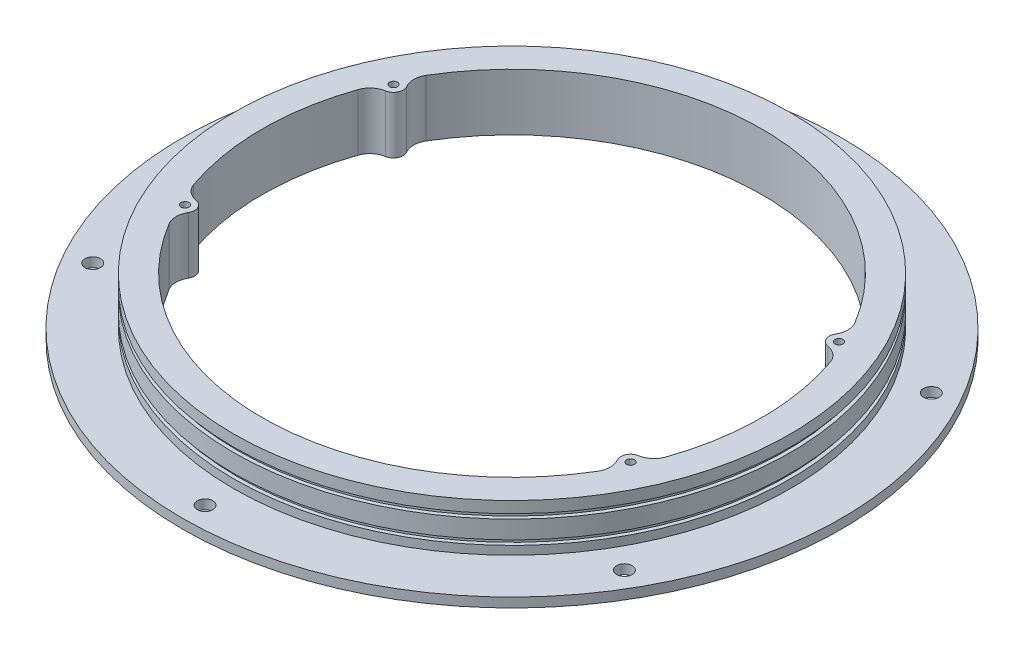
ISO-10303-21;
HEADER;
FILE_DESCRIPTION(('STEP AP214'),'2;1');
FILE_NAME('part.step','',(''),(''),'','','');
FILE_SCHEMA(('AUTOMOTIVE_DESIGN { 1 0 10303 214 1 1 1 1 }'));
ENDSEC;
DATA;
#1=APPLICATION_CONTEXT('core data for automotive mechanical design processes');
#2=APPLICATION_PROTOCOL_DEFINITION('international standard','automotive_design',2000,#1);
#3=PRODUCT_CONTEXT('',#1,'mechanical');
#4=PRODUCT('Part','Part','',(#3));
#5=PRODUCT_RELATED_PRODUCT_CATEGORY('part','',(#4));
#6=PRODUCT_DEFINITION_FORMATION('','',#4);
#7=PRODUCT_DEFINITION_CONTEXT('part definition',#1,'design');
#8=PRODUCT_DEFINITION('design','',#6,#7);
#9=PRODUCT_DEFINITION_SHAPE('','',#8);
#10=(LENGTH_UNIT() NAMED_UNIT(*) SI_UNIT(.MILLI.,.METRE.));
#11=(NAMED_UNIT(*) PLANE_ANGLE_UNIT() SI_UNIT($,.RADIAN.));
#12=(NAMED_UNIT(*) SI_UNIT($,.STERADIAN.) SOLID_ANGLE_UNIT());
#13=UNCERTAINTY_MEASURE_WITH_UNIT(LENGTH_MEASURE(1.E-05),#10,'distance_accuracy_value','');
#14=(GEOMETRIC_REPRESENTATION_CONTEXT(3) GLOBAL_UNCERTAINTY_ASSIGNED_CONTEXT((#13)) GLOBAL_UNIT_ASSIGNED_CONTEXT((#10,
#11,#12)) REPRESENTATION_CONTEXT('',''));
#15=CARTESIAN_POINT('',(0.,0.,0.));
#16=DIRECTION('',(0.,0.,1.));
#17=DIRECTION('',(1.,0.,0.));
#18=AXIS2_PLACEMENT_3D('',#15,#16,#17);
#19=CARTESIAN_POINT('',(0.,30.,0.));
#20=DIRECTION('',(0.,-1.,0.));
#21=DIRECTION('',(0.,0.,-1.));
#22=AXIS2_PLACEMENT_3D('',#19,#20,#21);
#23=CYLINDRICAL_SURFACE('',#22,146.85);
#24=CARTESIAN_POINT('',(0.,12.,0.));
#25=DIRECTION('',(0.,1.,0.));
#26=DIRECTION('',(0.,0.,1.));
#27=AXIS2_PLACEMENT_3D('',#24,#25,#26);
#28=CIRCLE('',#27,146.85);
#29=CARTESIAN_POINT('',(0.,12.,146.85));
#30=VERTEX_POINT('',#29);
#31=EDGE_CURVE('E442',#30,#30,#28,.T.);
#32=ORIENTED_EDGE('',*,*,#31,.T.);
#33=EDGE_LOOP('',(#32));
#34=FACE_BOUND('',#33,.T.);
#35=CARTESIAN_POINT('',(0.,21.5,0.));
#36=DIRECTION('',(0.,1.,0.));
#37=DIRECTION('',(0.,0.,1.));
#38=AXIS2_PLACEMENT_3D('',#35,#36,#37);
#39=CIRCLE('',#38,146.85);
#40=CARTESIAN_POINT('',(0.,21.5,146.85));
#41=VERTEX_POINT('',#40);
#42=EDGE_CURVE('E433',#41,#41,#39,.T.);
#43=ORIENTED_EDGE('',*,*,#42,.F.);
#44=EDGE_LOOP('',(#43));
#45=FACE_BOUND('',#44,.T.);
#46=ADVANCED_FACE('F43',(#34,#45),#23,.T.);
#47=CARTESIAN_POINT('',(0.,5.,0.));
#48=DIRECTION('',(0.,1.,0.));
#49=DIRECTION('',(0.,0.,1.));
#50=AXIS2_PLACEMENT_3D('',#47,#48,#49);
#51=CIRCLE('',#50,146.85);
#52=CARTESIAN_POINT('',(0.,5.,146.85));
#53=VERTEX_POINT('',#52);
#54=EDGE_CURVE('E273',#53,#53,#51,.F.);
#55=ORIENTED_EDGE('',*,*,#54,.F.);
#56=EDGE_LOOP('',(#55));
#57=FACE_BOUND('',#56,.T.);
#58=CARTESIAN_POINT('',(0.,9.5,0.));
#59=DIRECTION('',(0.,1.,0.));
#60=DIRECTION('',(0.,0.,1.));
#61=AXIS2_PLACEMENT_3D('',#58,#59,#60);
#62=CIRCLE('',#61,146.85);
#63=CARTESIAN_POINT('',(0.,9.5,146.85));
#64=VERTEX_POINT('',#63);
#65=EDGE_CURVE('E205',#64,#64,#62,.T.);
#66=ORIENTED_EDGE('',*,*,#65,.F.);
#67=EDGE_LOOP('',(#66));
#68=FACE_BOUND('',#67,.T.);
#69=ADVANCED_FACE('F399',(#57,#68),#23,.T.);
#70=CARTESIAN_POINT('',(0.,5.,0.));
#71=DIRECTION('',(0.,-1.,0.));
#72=DIRECTION('',(0.,0.,-1.));
#73=AXIS2_PLACEMENT_3D('',#70,#71,#72);
#74=CYLINDRICAL_SURFACE('',#73,131.85);
#75=CARTESIAN_POINT('',(0.,0.,0.));
#76=DIRECTION('',(0.,1.,0.));
#77=DIRECTION('',(0.,0.,1.));
#78=AXIS2_PLACEMENT_3D('',#75,#76,#77);
#79=CIRCLE('',#78,131.85);
#80=CARTESIAN_POINT('',(-124.505351615997,0.,-43.3917033426559));
#81=VERTEX_POINT('',#80);
#82=CARTESIAN_POINT('',(-124.505351615997,0.,43.3917033426559));
#83=VERTEX_POINT('',#82);
#84=EDGE_CURVE('E295',#81,#83,#79,.T.);
#85=ORIENTED_EDGE('',*,*,#84,.F.);
#86=DIRECTION('',(0.,-1.,0.));
#87=VECTOR('',#86,1.);
#88=CARTESIAN_POINT('',(-124.505351615997,30.,-43.3917033426559));
#89=LINE('',#88,#87);
#90=CARTESIAN_POINT('',(-124.505351615997,30.,-43.3917033426559));
#91=VERTEX_POINT('',#90);
#92=EDGE_CURVE('E263',#91,#81,#89,.T.);
#93=ORIENTED_EDGE('',*,*,#92,.F.);
#94=CARTESIAN_POINT('',(0.,30.,0.));
#95=DIRECTION('',(0.,1.,0.));
#96=DIRECTION('',(0.,0.,1.));
#97=AXIS2_PLACEMENT_3D('',#94,#95,#96);
#98=CIRCLE('',#97,131.85);
#99=CARTESIAN_POINT('',(-124.505351615997,30.,43.3917033426559));
#100=VERTEX_POINT('',#99);
#101=EDGE_CURVE('E332',#91,#100,#98,.T.);
#102=ORIENTED_EDGE('',*,*,#101,.T.);
#103=DIRECTION('',(0.,-1.,0.));
#104=VECTOR('',#103,1.);
#105=CARTESIAN_POINT('',(-124.505351615997,30.,43.3917033426559));
#106=LINE('',#105,#104);
#107=EDGE_CURVE('E265',#100,#83,#106,.T.);
#108=ORIENTED_EDGE('',*,*,#107,.T.);
#109=EDGE_LOOP('',(#85,#93,#102,#108));
#110=FACE_BOUND('',#109,.T.);
#111=ADVANCED_FACE('F45',(#110),#74,.F.);
#112=CARTESIAN_POINT('',(113.080257043753,0.,-67.8032297676063));
#113=VERTEX_POINT('',#112);
#114=CARTESIAN_POINT('',(-113.080257043753,0.,-67.8032297676063));
#115=VERTEX_POINT('',#114);
#116=EDGE_CURVE('E372',#113,#115,#79,.T.);
#117=ORIENTED_EDGE('',*,*,#116,.F.);
#118=DIRECTION('',(0.,-1.,0.));
#119=VECTOR('',#118,1.);
#120=CARTESIAN_POINT('',(113.080257043753,30.,-67.8032297676063));
#121=LINE('',#120,#119);
#122=CARTESIAN_POINT('',(113.080257043753,30.,-67.8032297676063));
#123=VERTEX_POINT('',#122);
#124=EDGE_CURVE('E254',#123,#113,#121,.T.);
#125=ORIENTED_EDGE('',*,*,#124,.F.);
#126=CARTESIAN_POINT('',(-113.080257043753,30.,-67.8032297676063));
#127=VERTEX_POINT('',#126);
#128=EDGE_CURVE('E192',#123,#127,#98,.T.);
#129=ORIENTED_EDGE('',*,*,#128,.T.);
#130=DIRECTION('',(0.,-1.,0.));
#131=VECTOR('',#130,1.);
#132=CARTESIAN_POINT('',(-113.080257043753,30.,-67.8032297676063));
#133=LINE('',#132,#131);
#134=EDGE_CURVE('E256',#127,#115,#133,.T.);
#135=ORIENTED_EDGE('',*,*,#134,.T.);
#136=EDGE_LOOP('',(#117,#125,#129,#135));
#137=FACE_BOUND('',#136,.T.);
#138=ADVANCED_FACE('F834',(#137),#74,.F.);
#139=CARTESIAN_POINT('',(124.505351615997,0.,43.3917033426559));
#140=VERTEX_POINT('',#139);
#141=CARTESIAN_POINT('',(124.505351615997,0.,-43.3917033426559));
#142=VERTEX_POINT('',#141);
#143=EDGE_CURVE('E296',#140,#142,#79,.T.);
#144=ORIENTED_EDGE('',*,*,#143,.F.);
#145=DIRECTION('',(0.,-1.,0.));
#146=VECTOR('',#145,1.);
#147=CARTESIAN_POINT('',(124.505351615997,30.,43.3917033426559));
#148=LINE('',#147,#146);
#149=CARTESIAN_POINT('',(124.505351615997,30.,43.3917033426559));
#150=VERTEX_POINT('',#149);
#151=EDGE_CURVE('E173',#150,#140,#148,.T.);
#152=ORIENTED_EDGE('',*,*,#151,.F.);
#153=CARTESIAN_POINT('',(124.505351615997,30.,-43.3917033426559));
#154=VERTEX_POINT('',#153);
#155=EDGE_CURVE('E188',#150,#154,#98,.T.);
#156=ORIENTED_EDGE('',*,*,#155,.T.);
#157=DIRECTION('',(0.,-1.,0.));
#158=VECTOR('',#157,1.);
#159=CARTESIAN_POINT('',(124.505351615997,30.,-43.3917033426559));
#160=LINE('',#159,#158);
#161=EDGE_CURVE('E246',#154,#142,#160,.T.);
#162=ORIENTED_EDGE('',*,*,#161,.T.);
#163=EDGE_LOOP('',(#144,#152,#156,#162));
#164=FACE_BOUND('',#163,.T.);
#165=ADVANCED_FACE('F369',(#164),#74,.F.);
#166=CARTESIAN_POINT('',(-113.080257043753,0.,67.8032297676062));
#167=VERTEX_POINT('',#166);
#168=CARTESIAN_POINT('',(113.080257043753,0.,67.8032297676062));
#169=VERTEX_POINT('',#168);
#170=EDGE_CURVE('E276',#167,#169,#79,.T.);
#171=ORIENTED_EDGE('',*,*,#170,.F.);
#172=DIRECTION('',(0.,-1.,0.));
#173=VECTOR('',#172,1.);
#174=CARTESIAN_POINT('',(-113.080257043753,30.,67.8032297676062));
#175=LINE('',#174,#173);
#176=CARTESIAN_POINT('',(-113.080257043753,30.,67.8032297676062));
#177=VERTEX_POINT('',#176);
#178=EDGE_CURVE('E123',#177,#167,#175,.T.);
#179=ORIENTED_EDGE('',*,*,#178,.F.);
#180=CARTESIAN_POINT('',(113.080257043753,30.,67.8032297676062));
#181=VERTEX_POINT('',#180);
#182=EDGE_CURVE('E193',#177,#181,#98,.T.);
#183=ORIENTED_EDGE('',*,*,#182,.T.);
#184=DIRECTION('',(0.,-1.,0.));
#185=VECTOR('',#184,1.);
#186=CARTESIAN_POINT('',(113.080257043753,30.,67.8032297676062));
#187=LINE('',#186,#185);
#188=EDGE_CURVE('E62',#181,#169,#187,.T.);
#189=ORIENTED_EDGE('',*,*,#188,.T.);
#190=EDGE_LOOP('',(#171,#179,#183,#189));
#191=FACE_BOUND('',#190,.T.);
#192=ADVANCED_FACE('F327',(#191),#74,.F.);
#193=CARTESIAN_POINT('',(0.,5.,-161.925));
#194=DIRECTION('',(0.,-1.,0.));
#195=DIRECTION('',(0.,0.,-1.));
#196=AXIS2_PLACEMENT_3D('',#193,#194,#195);
#197=CYLINDRICAL_SURFACE('',#196,4.09999999999999);
#198=CARTESIAN_POINT('',(0.,5.,-161.925));
#199=DIRECTION('',(0.,1.,0.));
#200=DIRECTION('',(0.,0.,1.));
#201=AXIS2_PLACEMENT_3D('',#198,#199,#200);
#202=CIRCLE('',#201,4.09999999999999);
#203=CARTESIAN_POINT('',(0.,5.,-157.825));
#204=VERTEX_POINT('',#203);
#205=EDGE_CURVE('E53',#204,#204,#202,.T.);
#206=ORIENTED_EDGE('',*,*,#205,.T.);
#207=EDGE_LOOP('',(#206));
#208=FACE_BOUND('',#207,.T.);
#209=CARTESIAN_POINT('',(0.,0.,-161.925));
#210=DIRECTION('',(0.,1.,0.));
#211=DIRECTION('',(0.,0.,1.));
#212=AXIS2_PLACEMENT_3D('',#209,#210,#211);
#213=CIRCLE('',#212,4.09999999999999);
#214=CARTESIAN_POINT('',(0.,0.,-157.825));
#215=VERTEX_POINT('',#214);
#216=EDGE_CURVE('E311',#215,#215,#213,.T.);
#217=ORIENTED_EDGE('',*,*,#216,.F.);
#218=EDGE_LOOP('',(#217));
#219=FACE_BOUND('',#218,.T.);
#220=ADVANCED_FACE('F484',(#208,#219),#197,.F.);
#221=CARTESIAN_POINT('',(140.231163507799,5.,-80.9625000000059));
#222=DIRECTION('',(0.,-1.,0.));
#223=DIRECTION('',(0.,0.,-1.));
#224=AXIS2_PLACEMENT_3D('',#221,#222,#223);
#225=CYLINDRICAL_SURFACE('',#224,4.09999999999998);
#226=CARTESIAN_POINT('',(140.231163507799,5.,-80.9625000000059));
#227=DIRECTION('',(0.,1.,0.));
#228=DIRECTION('',(0.,0.,1.));
#229=AXIS2_PLACEMENT_3D('',#226,#227,#228);
#230=CIRCLE('',#229,4.09999999999998);
#231=CARTESIAN_POINT('',(140.231163507799,5.,-76.862500000006));
#232=VERTEX_POINT('',#231);
#233=EDGE_CURVE('E289',#232,#232,#230,.T.);
#234=ORIENTED_EDGE('',*,*,#233,.T.);
#235=EDGE_LOOP('',(#234));
#236=FACE_BOUND('',#235,.T.);
#237=CARTESIAN_POINT('',(140.231163507799,0.,-80.9625000000059));
#238=DIRECTION('',(0.,1.,0.));
#239=DIRECTION('',(0.,0.,1.));
#240=AXIS2_PLACEMENT_3D('',#237,#238,#239);
#241=CIRCLE('',#240,4.09999999999998);
#242=CARTESIAN_POINT('',(140.231163507799,0.,-76.862500000006));
#243=VERTEX_POINT('',#242);
#244=EDGE_CURVE('E309',#243,#243,#241,.T.);
#245=ORIENTED_EDGE('',*,*,#244,.F.);
#246=EDGE_LOOP('',(#245));
#247=FACE_BOUND('',#246,.T.);
#248=ADVANCED_FACE('F487',(#236,#247),#225,.F.);
#249=CARTESIAN_POINT('',(140.231163507805,5.,80.9624999999941));
#250=DIRECTION('',(0.,-1.,0.));
#251=DIRECTION('',(0.,0.,-1.));
#252=AXIS2_PLACEMENT_3D('',#249,#250,#251);
#253=CYLINDRICAL_SURFACE('',#252,4.09999999999998);
#254=CARTESIAN_POINT('',(140.231163507805,5.,80.9624999999941));
#255=DIRECTION('',(0.,1.,0.));
#256=DIRECTION('',(0.,0.,1.));
#257=AXIS2_PLACEMENT_3D('',#254,#255,#256);
#258=CIRCLE('',#257,4.09999999999998);
#259=CARTESIAN_POINT('',(140.231163507805,5.,85.0624999999941));
#260=VERTEX_POINT('',#259);
#261=EDGE_CURVE('E286',#260,#260,#258,.T.);
#262=ORIENTED_EDGE('',*,*,#261,.T.);
#263=EDGE_LOOP('',(#262));
#264=FACE_BOUND('',#263,.T.);
#265=CARTESIAN_POINT('',(140.231163507805,0.,80.9624999999941));
#266=DIRECTION('',(0.,1.,0.));
#267=DIRECTION('',(0.,0.,1.));
#268=AXIS2_PLACEMENT_3D('',#265,#266,#267);
#269=CIRCLE('',#268,4.09999999999998);
#270=CARTESIAN_POINT('',(140.231163507805,0.,85.0624999999941));
#271=VERTEX_POINT('',#270);
#272=EDGE_CURVE('E306',#271,#271,#269,.T.);
#273=ORIENTED_EDGE('',*,*,#272,.F.);
#274=EDGE_LOOP('',(#273));
#275=FACE_BOUND('',#274,.T.);
#276=ADVANCED_FACE('F491',(#264,#275),#253,.F.);
#277=CARTESIAN_POINT('',(1.36158713980121E-11,5.,161.925));
#278=DIRECTION('',(0.,-1.,0.));
#279=DIRECTION('',(0.,0.,-1.));
#280=AXIS2_PLACEMENT_3D('',#277,#278,#279);
#281=CYLINDRICAL_SURFACE('',#280,4.09999999999999);
#282=CARTESIAN_POINT('',(1.36158713980121E-11,5.,161.925));
#283=DIRECTION('',(0.,1.,0.));
#284=DIRECTION('',(0.,0.,1.));
#285=AXIS2_PLACEMENT_3D('',#282,#283,#284);
#286=CIRCLE('',#285,4.09999999999999);
#287=CARTESIAN_POINT('',(1.36158713980121E-11,5.,166.025));
#288=VERTEX_POINT('',#287);
#289=EDGE_CURVE('E283',#288,#288,#286,.T.);
#290=ORIENTED_EDGE('',*,*,#289,.T.);
#291=EDGE_LOOP('',(#290));
#292=FACE_BOUND('',#291,.T.);
#293=CARTESIAN_POINT('',(1.36158713980121E-11,0.,161.925));
#294=DIRECTION('',(0.,1.,0.));
#295=DIRECTION('',(0.,0.,1.));
#296=AXIS2_PLACEMENT_3D('',#293,#294,#295);
#297=CIRCLE('',#296,4.09999999999999);
#298=CARTESIAN_POINT('',(1.36158713980121E-11,0.,166.025));
#299=VERTEX_POINT('',#298);
#300=EDGE_CURVE('E303',#299,#299,#297,.T.);
#301=ORIENTED_EDGE('',*,*,#300,.F.);
#302=EDGE_LOOP('',(#301));
#303=FACE_BOUND('',#302,.T.);
#304=ADVANCED_FACE('F495',(#292,#303),#281,.F.);
#305=CARTESIAN_POINT('',(-140.231163507785,5.,80.9625000000059));
#306=DIRECTION('',(0.,-1.,0.));
#307=DIRECTION('',(0.,0.,-1.));
#308=AXIS2_PLACEMENT_3D('',#305,#306,#307);
#309=CYLINDRICAL_SURFACE('',#308,4.09999999999998);
#310=CARTESIAN_POINT('',(-140.231163507785,5.,80.9625000000059));
#311=DIRECTION('',(0.,1.,0.));
#312=DIRECTION('',(0.,0.,1.));
#313=AXIS2_PLACEMENT_3D('',#310,#311,#312);
#314=CIRCLE('',#313,4.09999999999998);
#315=CARTESIAN_POINT('',(-140.231163507785,5.,85.0625000000059));
#316=VERTEX_POINT('',#315);
#317=EDGE_CURVE('E280',#316,#316,#314,.T.);
#318=ORIENTED_EDGE('',*,*,#317,.T.);
#319=EDGE_LOOP('',(#318));
#320=FACE_BOUND('',#319,.T.);
#321=CARTESIAN_POINT('',(-140.231163507785,0.,80.9625000000059));
#322=DIRECTION('',(0.,1.,0.));
#323=DIRECTION('',(0.,0.,1.));
#324=AXIS2_PLACEMENT_3D('',#321,#322,#323);
#325=CIRCLE('',#324,4.09999999999998);
#326=CARTESIAN_POINT('',(-140.231163507785,0.,85.0625000000059));
#327=VERTEX_POINT('',#326);
#328=EDGE_CURVE('E300',#327,#327,#325,.T.);
#329=ORIENTED_EDGE('',*,*,#328,.F.);
#330=EDGE_LOOP('',(#329));
#331=FACE_BOUND('',#330,.T.);
#332=ADVANCED_FACE('F499',(#320,#331),#309,.F.);
#333=CARTESIAN_POINT('',(-140.231163507792,5.,-80.962499999994));
#334=DIRECTION('',(0.,-1.,0.));
#335=DIRECTION('',(0.,0.,-1.));
#336=AXIS2_PLACEMENT_3D('',#333,#334,#335);
#337=CYLINDRICAL_SURFACE('',#336,4.09999999999998);
#338=CARTESIAN_POINT('',(-140.231163507792,5.,-80.962499999994));
#339=DIRECTION('',(0.,1.,0.));
#340=DIRECTION('',(0.,0.,1.));
#341=AXIS2_PLACEMENT_3D('',#338,#339,#340);
#342=CIRCLE('',#341,4.09999999999998);
#343=CARTESIAN_POINT('',(-140.231163507792,5.,-76.862499999994));
#344=VERTEX_POINT('',#343);
#345=EDGE_CURVE('E277',#344,#344,#342,.T.);
#346=ORIENTED_EDGE('',*,*,#345,.T.);
#347=EDGE_LOOP('',(#346));
#348=FACE_BOUND('',#347,.T.);
#349=CARTESIAN_POINT('',(-140.231163507792,0.,-80.962499999994));
#350=DIRECTION('',(0.,1.,0.));
#351=DIRECTION('',(0.,0.,1.));
#352=AXIS2_PLACEMENT_3D('',#349,#350,#351);
#353=CIRCLE('',#352,4.09999999999998);
#354=CARTESIAN_POINT('',(-140.231163507792,0.,-76.862499999994));
#355=VERTEX_POINT('',#354);
#356=EDGE_CURVE('E297',#355,#355,#353,.T.);
#357=ORIENTED_EDGE('',*,*,#356,.F.);
#358=EDGE_LOOP('',(#357));
#359=FACE_BOUND('',#358,.T.);
#360=ADVANCED_FACE('F482',(#348,#359),#337,.F.);
#361=CARTESIAN_POINT('',(0.,5.,0.));
#362=DIRECTION('',(0.,-1.,0.));
#363=DIRECTION('',(0.,0.,-1.));
#364=AXIS2_PLACEMENT_3D('',#361,#362,#363);
#365=CYLINDRICAL_SURFACE('',#364,173.85);
#366=CARTESIAN_POINT('',(0.,5.,0.));
#367=DIRECTION('',(0.,1.,0.));
#368=DIRECTION('',(0.,0.,1.));
#369=AXIS2_PLACEMENT_3D('',#366,#367,#368);
#370=CIRCLE('',#369,173.85);
#371=CARTESIAN_POINT('',(0.,5.,173.85));
#372=VERTEX_POINT('',#371);
#373=EDGE_CURVE('E11',#372,#372,#370,.T.);
#374=ORIENTED_EDGE('',*,*,#373,.F.);
#375=EDGE_LOOP('',(#374));
#376=FACE_BOUND('',#375,.T.);
#377=CARTESIAN_POINT('',(0.,0.,0.));
#378=DIRECTION('',(0.,1.,0.));
#379=DIRECTION('',(0.,0.,1.));
#380=AXIS2_PLACEMENT_3D('',#377,#378,#379);
#381=CIRCLE('',#380,173.85);
#382=CARTESIAN_POINT('',(0.,0.,173.85));
#383=VERTEX_POINT('',#382);
#384=EDGE_CURVE('E47',#383,#383,#381,.T.);
#385=ORIENTED_EDGE('',*,*,#384,.T.);
#386=EDGE_LOOP('',(#385));
#387=FACE_BOUND('',#386,.T.);
#388=ADVANCED_FACE('F318',(#376,#387),#365,.T.);
#389=CARTESIAN_POINT('',(0.,5.,0.));
#390=DIRECTION('',(0.,1.,0.));
#391=DIRECTION('',(0.,0.,1.));
#392=AXIS2_PLACEMENT_3D('',#389,#390,#391);
#393=PLANE('',#392);
#394=ORIENTED_EDGE('',*,*,#54,.T.);
#395=EDGE_LOOP('',(#394));
#396=FACE_BOUND('',#395,.T.);
#397=ORIENTED_EDGE('',*,*,#345,.F.);
#398=EDGE_LOOP('',(#397));
#399=FACE_BOUND('',#398,.T.);
#400=ORIENTED_EDGE('',*,*,#317,.F.);
#401=EDGE_LOOP('',(#400));
#402=FACE_BOUND('',#401,.T.);
#403=ORIENTED_EDGE('',*,*,#289,.F.);
#404=EDGE_LOOP('',(#403));
#405=FACE_BOUND('',#404,.T.);
#406=ORIENTED_EDGE('',*,*,#261,.F.);
#407=EDGE_LOOP('',(#406));
#408=FACE_BOUND('',#407,.T.);
#409=ORIENTED_EDGE('',*,*,#233,.F.);
#410=EDGE_LOOP('',(#409));
#411=FACE_BOUND('',#410,.T.);
#412=ORIENTED_EDGE('',*,*,#205,.F.);
#413=EDGE_LOOP('',(#412));
#414=FACE_BOUND('',#413,.T.);
#415=ORIENTED_EDGE('',*,*,#373,.T.);
#416=EDGE_LOOP('',(#415));
#417=FACE_BOUND('',#416,.T.);
#418=ADVANCED_FACE('F323',(#396,#399,#402,#405,#408,#411,#414,#417),#393,.T.);
#419=CARTESIAN_POINT('',(0.,0.,0.));
#420=DIRECTION('',(0.,1.,0.));
#421=DIRECTION('',(0.,0.,1.));
#422=AXIS2_PLACEMENT_3D('',#419,#420,#421);
#423=PLANE('',#422);
#424=CARTESIAN_POINT('',(117.516222284415,0.,55.));
#425=DIRECTION('',(0.,1.,0.));
#426=DIRECTION('',(0.,0.,1.));
#427=AXIS2_PLACEMENT_3D('',#424,#425,#426);
#428=CIRCLE('',#427,2.1);
#429=CARTESIAN_POINT('',(117.516222284415,0.,57.1));
#430=VERTEX_POINT('',#429);
#431=EDGE_CURVE('E201',#430,#430,#428,.T.);
#432=ORIENTED_EDGE('',*,*,#431,.T.);
#433=EDGE_LOOP('',(#432));
#434=FACE_BOUND('',#433,.T.);
#435=CARTESIAN_POINT('',(117.516222284415,0.,-55.));
#436=DIRECTION('',(0.,1.,0.));
#437=DIRECTION('',(0.,0.,1.));
#438=AXIS2_PLACEMENT_3D('',#435,#436,#437);
#439=CIRCLE('',#438,2.1);
#440=CARTESIAN_POINT('',(117.516222284415,0.,-52.9));
#441=VERTEX_POINT('',#440);
#442=EDGE_CURVE('E204',#441,#441,#439,.T.);
#443=ORIENTED_EDGE('',*,*,#442,.T.);
#444=EDGE_LOOP('',(#443));
#445=FACE_BOUND('',#444,.T.);
#446=CARTESIAN_POINT('',(-117.516222284415,0.,-55.));
#447=DIRECTION('',(0.,1.,0.));
#448=DIRECTION('',(0.,0.,1.));
#449=AXIS2_PLACEMENT_3D('',#446,#447,#448);
#450=CIRCLE('',#449,2.1);
#451=CARTESIAN_POINT('',(-117.516222284415,0.,-52.9));
#452=VERTEX_POINT('',#451);
#453=EDGE_CURVE('E208',#452,#452,#450,.T.);
#454=ORIENTED_EDGE('',*,*,#453,.T.);
#455=EDGE_LOOP('',(#454));
#456=FACE_BOUND('',#455,.T.);
#457=CARTESIAN_POINT('',(-117.516222284415,0.,55.));
#458=DIRECTION('',(0.,1.,0.));
#459=DIRECTION('',(0.,0.,1.));
#460=AXIS2_PLACEMENT_3D('',#457,#458,#459);
#461=CIRCLE('',#460,2.1);
#462=CARTESIAN_POINT('',(-117.516222284415,0.,57.1));
#463=VERTEX_POINT('',#462);
#464=EDGE_CURVE('E211',#463,#463,#461,.T.);
#465=ORIENTED_EDGE('',*,*,#464,.T.);
#466=EDGE_LOOP('',(#465));
#467=FACE_BOUND('',#466,.T.);
#468=ORIENTED_EDGE('',*,*,#356,.T.);
#469=EDGE_LOOP('',(#468));
#470=FACE_BOUND('',#469,.T.);
#471=ORIENTED_EDGE('',*,*,#328,.T.);
#472=EDGE_LOOP('',(#471));
#473=FACE_BOUND('',#472,.T.);
#474=ORIENTED_EDGE('',*,*,#300,.T.);
#475=EDGE_LOOP('',(#474));
#476=FACE_BOUND('',#475,.T.);
#477=ORIENTED_EDGE('',*,*,#272,.T.);
#478=EDGE_LOOP('',(#477));
#479=FACE_BOUND('',#478,.T.);
#480=ORIENTED_EDGE('',*,*,#244,.T.);
#481=EDGE_LOOP('',(#480));
#482=FACE_BOUND('',#481,.T.);
#483=ORIENTED_EDGE('',*,*,#216,.T.);
#484=EDGE_LOOP('',(#483));
#485=FACE_BOUND('',#484,.T.);
#486=ORIENTED_EDGE('',*,*,#384,.F.);
#487=EDGE_LOOP('',(#486));
#488=FACE_BOUND('',#487,.T.);
#489=ORIENTED_EDGE('',*,*,#170,.T.);
#490=CARTESIAN_POINT('',(104.503824958523,0.,62.6607777564112));
#491=DIRECTION('',(0.,1.,0.));
#492=DIRECTION('',(0.,0.,1.));
#493=AXIS2_PLACEMENT_3D('',#490,#491,#492);
#494=CIRCLE('',#493,10.);
#495=CARTESIAN_POINT('',(113.121306631299,0.,57.587415003821));
#496=VERTEX_POINT('',#495);
#497=EDGE_CURVE('E114',#496,#169,#494,.F.);
#498=ORIENTED_EDGE('',*,*,#497,.F.);
#499=CARTESIAN_POINT('',(117.516222284415,0.,55.));
#500=DIRECTION('',(0.,1.,0.));
#501=DIRECTION('',(0.,0.,1.));
#502=AXIS2_PLACEMENT_3D('',#499,#500,#501);
#503=CIRCLE('',#502,5.09999999999999);
#504=CARTESIAN_POINT('',(116.687446985204,0.,49.9677905942401));
#505=VERTEX_POINT('',#504);
#506=EDGE_CURVE('E239',#505,#496,#503,.T.);
#507=ORIENTED_EDGE('',*,*,#506,.F.);
#508=CARTESIAN_POINT('',(115.062397378909,0.,40.1007133280442));
#509=DIRECTION('',(0.,1.,0.));
#510=DIRECTION('',(0.,0.,1.));
#511=AXIS2_PLACEMENT_3D('',#508,#509,#510);
#512=CIRCLE('',#511,9.99999999999997);
#513=EDGE_CURVE('E170',#505,#140,#512,.T.);
#514=ORIENTED_EDGE('',*,*,#513,.T.);
#515=ORIENTED_EDGE('',*,*,#143,.T.);
#516=CARTESIAN_POINT('',(115.062397378909,0.,-40.1007133280442));
#517=DIRECTION('',(0.,1.,0.));
#518=DIRECTION('',(0.,0.,1.));
#519=AXIS2_PLACEMENT_3D('',#516,#517,#518);
#520=CIRCLE('',#519,9.99999999999999);
#521=CARTESIAN_POINT('',(116.687446985204,0.,-49.9677905942401));
#522=VERTEX_POINT('',#521);
#523=EDGE_CURVE('E236',#522,#142,#520,.F.);
#524=ORIENTED_EDGE('',*,*,#523,.F.);
#525=CARTESIAN_POINT('',(117.516222284415,0.,-55.));
#526=DIRECTION('',(0.,1.,0.));
#527=DIRECTION('',(0.,0.,1.));
#528=AXIS2_PLACEMENT_3D('',#525,#526,#527);
#529=CIRCLE('',#528,5.10000000000003);
#530=CARTESIAN_POINT('',(113.121306631299,0.,-57.5874150038211));
#531=VERTEX_POINT('',#530);
#532=EDGE_CURVE('E233',#531,#522,#529,.T.);
#533=ORIENTED_EDGE('',*,*,#532,.F.);
#534=CARTESIAN_POINT('',(104.503824958523,0.,-62.6607777564113));
#535=DIRECTION('',(0.,1.,0.));
#536=DIRECTION('',(0.,0.,1.));
#537=AXIS2_PLACEMENT_3D('',#534,#535,#536);
#538=CIRCLE('',#537,9.99999999999998);
#539=EDGE_CURVE('E230',#531,#113,#538,.T.);
#540=ORIENTED_EDGE('',*,*,#539,.T.);
#541=ORIENTED_EDGE('',*,*,#116,.T.);
#542=CARTESIAN_POINT('',(-104.503824958523,0.,-62.6607777564113));
#543=DIRECTION('',(0.,1.,0.));
#544=DIRECTION('',(0.,0.,1.));
#545=AXIS2_PLACEMENT_3D('',#542,#543,#544);
#546=CIRCLE('',#545,9.99999999999998);
#547=CARTESIAN_POINT('',(-113.121306631299,0.,-57.587415003821));
#548=VERTEX_POINT('',#547);
#549=EDGE_CURVE('E228',#548,#115,#546,.F.);
#550=ORIENTED_EDGE('',*,*,#549,.F.);
#551=CARTESIAN_POINT('',(-117.516222284415,0.,-55.));
#552=DIRECTION('',(0.,1.,0.));
#553=DIRECTION('',(0.,0.,1.));
#554=AXIS2_PLACEMENT_3D('',#551,#552,#553);
#555=CIRCLE('',#554,5.10000000000003);
#556=CARTESIAN_POINT('',(-116.687446985204,0.,-49.9677905942401));
#557=VERTEX_POINT('',#556);
#558=EDGE_CURVE('E225',#548,#557,#555,.F.);
#559=ORIENTED_EDGE('',*,*,#558,.T.);
#560=CARTESIAN_POINT('',(-115.062397378909,0.,-40.1007133280442));
#561=DIRECTION('',(0.,1.,0.));
#562=DIRECTION('',(0.,0.,1.));
#563=AXIS2_PLACEMENT_3D('',#560,#561,#562);
#564=CIRCLE('',#563,10.);
#565=EDGE_CURVE('E222',#557,#81,#564,.T.);
#566=ORIENTED_EDGE('',*,*,#565,.T.);
#567=ORIENTED_EDGE('',*,*,#84,.T.);
#568=CARTESIAN_POINT('',(-115.062397378909,0.,40.1007133280442));
#569=DIRECTION('',(0.,1.,0.));
#570=DIRECTION('',(0.,0.,1.));
#571=AXIS2_PLACEMENT_3D('',#568,#569,#570);
#572=CIRCLE('',#571,9.99999999999999);
#573=CARTESIAN_POINT('',(-116.687446985204,0.,49.9677905942401));
#574=VERTEX_POINT('',#573);
#575=EDGE_CURVE('E220',#574,#83,#572,.F.);
#576=ORIENTED_EDGE('',*,*,#575,.F.);
#577=CARTESIAN_POINT('',(-117.516222284415,0.,55.));
#578=DIRECTION('',(0.,1.,0.));
#579=DIRECTION('',(0.,0.,1.));
#580=AXIS2_PLACEMENT_3D('',#577,#578,#579);
#581=CIRCLE('',#580,5.10000000000001);
#582=CARTESIAN_POINT('',(-113.121306631299,0.,57.587415003821));
#583=VERTEX_POINT('',#582);
#584=EDGE_CURVE('E217',#574,#583,#581,.F.);
#585=ORIENTED_EDGE('',*,*,#584,.T.);
#586=CARTESIAN_POINT('',(-104.503824958523,0.,62.6607777564112));
#587=DIRECTION('',(0.,1.,0.));
#588=DIRECTION('',(0.,0.,1.));
#589=AXIS2_PLACEMENT_3D('',#586,#587,#588);
#590=CIRCLE('',#589,9.99999999999999);
#591=EDGE_CURVE('E214',#583,#167,#590,.T.);
#592=ORIENTED_EDGE('',*,*,#591,.T.);
#593=EDGE_LOOP('',(#489,#498,#507,#514,#515,#524,#533,#540,#541,#550,#559,#566,#567,#576,#585,#592));
#594=FACE_BOUND('',#593,.T.);
#595=ADVANCED_FACE('F320',(#434,#445,#456,#467,#470,#473,#476,#479,#482,#485,#488,#594),#423,.F.);
#596=CARTESIAN_POINT('',(-104.503824958523,30.,62.6607777564112));
#597=DIRECTION('',(0.,-1.,0.));
#598=DIRECTION('',(0.,0.,-1.));
#599=AXIS2_PLACEMENT_3D('',#596,#597,#598);
#600=CYLINDRICAL_SURFACE('',#599,9.99999999999999);
#601=ORIENTED_EDGE('',*,*,#591,.F.);
#602=DIRECTION('',(0.,-1.,0.));
#603=VECTOR('',#602,1.);
#604=CARTESIAN_POINT('',(-113.121306631299,30.,57.587415003821));
#605=LINE('',#604,#603);
#606=CARTESIAN_POINT('',(-113.121306631299,30.,57.587415003821));
#607=VERTEX_POINT('',#606);
#608=EDGE_CURVE('E270',#607,#583,#605,.T.);
#609=ORIENTED_EDGE('',*,*,#608,.F.);
#610=CARTESIAN_POINT('',(-104.503824958523,30.,62.6607777564112));
#611=DIRECTION('',(0.,1.,0.));
#612=DIRECTION('',(0.,0.,1.));
#613=AXIS2_PLACEMENT_3D('',#610,#611,#612);
#614=CIRCLE('',#613,9.99999999999999);
#615=EDGE_CURVE('E330',#607,#177,#614,.T.);
#616=ORIENTED_EDGE('',*,*,#615,.T.);
#617=ORIENTED_EDGE('',*,*,#178,.T.);
#618=EDGE_LOOP('',(#601,#609,#616,#617));
#619=FACE_BOUND('',#618,.T.);
#620=ADVANCED_FACE('F322',(#619),#600,.F.);
#621=CARTESIAN_POINT('',(-117.516222284415,30.,55.));
#622=DIRECTION('',(0.,-1.,0.));
#623=DIRECTION('',(0.,0.,-1.));
#624=AXIS2_PLACEMENT_3D('',#621,#622,#623);
#625=CYLINDRICAL_SURFACE('',#624,5.10000000000001);
#626=ORIENTED_EDGE('',*,*,#584,.F.);
#627=DIRECTION('',(0.,-1.,0.));
#628=VECTOR('',#627,1.);
#629=CARTESIAN_POINT('',(-116.687446985204,30.,49.9677905942401));
#630=LINE('',#629,#628);
#631=CARTESIAN_POINT('',(-116.687446985204,30.,49.9677905942401));
#632=VERTEX_POINT('',#631);
#633=EDGE_CURVE('E268',#632,#574,#630,.T.);
#634=ORIENTED_EDGE('',*,*,#633,.F.);
#635=CARTESIAN_POINT('',(-117.516222284415,30.,55.));
#636=DIRECTION('',(0.,1.,0.));
#637=DIRECTION('',(0.,0.,1.));
#638=AXIS2_PLACEMENT_3D('',#635,#636,#637);
#639=CIRCLE('',#638,5.10000000000001);
#640=EDGE_CURVE('E333',#632,#607,#639,.F.);
#641=ORIENTED_EDGE('',*,*,#640,.T.);
#642=ORIENTED_EDGE('',*,*,#608,.T.);
#643=EDGE_LOOP('',(#626,#634,#641,#642));
#644=FACE_BOUND('',#643,.T.);
#645=ADVANCED_FACE('F389',(#644),#625,.T.);
#646=CARTESIAN_POINT('',(-115.062397378909,30.,40.1007133280442));
#647=DIRECTION('',(0.,-1.,0.));
#648=DIRECTION('',(0.,0.,-1.));
#649=AXIS2_PLACEMENT_3D('',#646,#647,#648);
#650=CYLINDRICAL_SURFACE('',#649,9.99999999999999);
#651=ORIENTED_EDGE('',*,*,#575,.T.);
#652=ORIENTED_EDGE('',*,*,#107,.F.);
#653=CARTESIAN_POINT('',(-115.062397378909,30.,40.1007133280442));
#654=DIRECTION('',(0.,1.,0.));
#655=DIRECTION('',(0.,0.,1.));
#656=AXIS2_PLACEMENT_3D('',#653,#654,#655);
#657=CIRCLE('',#656,9.99999999999999);
#658=EDGE_CURVE('E340',#632,#100,#657,.F.);
#659=ORIENTED_EDGE('',*,*,#658,.F.);
#660=ORIENTED_EDGE('',*,*,#633,.T.);
#661=EDGE_LOOP('',(#651,#652,#659,#660));
#662=FACE_BOUND('',#661,.T.);
#663=ADVANCED_FACE('F383',(#662),#650,.F.);
#664=CARTESIAN_POINT('',(-115.062397378909,30.,-40.1007133280442));
#665=DIRECTION('',(0.,-1.,0.));
#666=DIRECTION('',(0.,0.,-1.));
#667=AXIS2_PLACEMENT_3D('',#664,#665,#666);
#668=CYLINDRICAL_SURFACE('',#667,10.);
#669=ORIENTED_EDGE('',*,*,#565,.F.);
#670=DIRECTION('',(0.,-1.,0.));
#671=VECTOR('',#670,1.);
#672=CARTESIAN_POINT('',(-116.687446985204,30.,-49.9677905942401));
#673=LINE('',#672,#671);
#674=CARTESIAN_POINT('',(-116.687446985204,30.,-49.9677905942401));
#675=VERTEX_POINT('',#674);
#676=EDGE_CURVE('E261',#675,#557,#673,.T.);
#677=ORIENTED_EDGE('',*,*,#676,.F.);
#678=CARTESIAN_POINT('',(-115.062397378909,30.,-40.1007133280442));
#679=DIRECTION('',(0.,1.,0.));
#680=DIRECTION('',(0.,0.,1.));
#681=AXIS2_PLACEMENT_3D('',#678,#679,#680);
#682=CIRCLE('',#681,10.);
#683=EDGE_CURVE('E339',#675,#91,#682,.T.);
#684=ORIENTED_EDGE('',*,*,#683,.T.);
#685=ORIENTED_EDGE('',*,*,#92,.T.);
#686=EDGE_LOOP('',(#669,#677,#684,#685));
#687=FACE_BOUND('',#686,.T.);
#688=ADVANCED_FACE('F575',(#687),#668,.F.);
#689=CARTESIAN_POINT('',(-117.516222284415,30.,-55.));
#690=DIRECTION('',(0.,-1.,0.));
#691=DIRECTION('',(0.,0.,-1.));
#692=AXIS2_PLACEMENT_3D('',#689,#690,#691);
#693=CYLINDRICAL_SURFACE('',#692,5.10000000000003);
#694=ORIENTED_EDGE('',*,*,#558,.F.);
#695=DIRECTION('',(0.,-1.,0.));
#696=VECTOR('',#695,1.);
#697=CARTESIAN_POINT('',(-113.121306631299,30.,-57.587415003821));
#698=LINE('',#697,#696);
#699=CARTESIAN_POINT('',(-113.121306631299,30.,-57.587415003821));
#700=VERTEX_POINT('',#699);
#701=EDGE_CURVE('E259',#700,#548,#698,.T.);
#702=ORIENTED_EDGE('',*,*,#701,.F.);
#703=CARTESIAN_POINT('',(-117.516222284415,30.,-55.));
#704=DIRECTION('',(0.,1.,0.));
#705=DIRECTION('',(0.,0.,1.));
#706=AXIS2_PLACEMENT_3D('',#703,#704,#705);
#707=CIRCLE('',#706,5.10000000000003);
#708=EDGE_CURVE('E344',#700,#675,#707,.F.);
#709=ORIENTED_EDGE('',*,*,#708,.T.);
#710=ORIENTED_EDGE('',*,*,#676,.T.);
#711=EDGE_LOOP('',(#694,#702,#709,#710));
#712=FACE_BOUND('',#711,.T.);
#713=ADVANCED_FACE('F585',(#712),#693,.T.);
#714=CARTESIAN_POINT('',(-104.503824958523,30.,-62.6607777564113));
#715=DIRECTION('',(0.,-1.,0.));
#716=DIRECTION('',(0.,0.,-1.));
#717=AXIS2_PLACEMENT_3D('',#714,#715,#716);
#718=CYLINDRICAL_SURFACE('',#717,9.99999999999998);
#719=ORIENTED_EDGE('',*,*,#549,.T.);
#720=ORIENTED_EDGE('',*,*,#134,.F.);
#721=CARTESIAN_POINT('',(-104.503824958523,30.,-62.6607777564113));
#722=DIRECTION('',(0.,1.,0.));
#723=DIRECTION('',(0.,0.,1.));
#724=AXIS2_PLACEMENT_3D('',#721,#722,#723);
#725=CIRCLE('',#724,9.99999999999998);
#726=EDGE_CURVE('E350',#700,#127,#725,.F.);
#727=ORIENTED_EDGE('',*,*,#726,.F.);
#728=ORIENTED_EDGE('',*,*,#701,.T.);
#729=EDGE_LOOP('',(#719,#720,#727,#728));
#730=FACE_BOUND('',#729,.T.);
#731=ADVANCED_FACE('F596',(#730),#718,.F.);
#732=CARTESIAN_POINT('',(104.503824958523,30.,-62.6607777564113));
#733=DIRECTION('',(0.,-1.,0.));
#734=DIRECTION('',(0.,0.,-1.));
#735=AXIS2_PLACEMENT_3D('',#732,#733,#734);
#736=CYLINDRICAL_SURFACE('',#735,9.99999999999998);
#737=ORIENTED_EDGE('',*,*,#539,.F.);
#738=DIRECTION('',(0.,-1.,0.));
#739=VECTOR('',#738,1.);
#740=CARTESIAN_POINT('',(113.121306631299,30.,-57.5874150038211));
#741=LINE('',#740,#739);
#742=CARTESIAN_POINT('',(113.121306631299,30.,-57.5874150038211));
#743=VERTEX_POINT('',#742);
#744=EDGE_CURVE('E252',#743,#531,#741,.T.);
#745=ORIENTED_EDGE('',*,*,#744,.F.);
#746=CARTESIAN_POINT('',(104.503824958523,30.,-62.6607777564113));
#747=DIRECTION('',(0.,1.,0.));
#748=DIRECTION('',(0.,0.,1.));
#749=AXIS2_PLACEMENT_3D('',#746,#747,#748);
#750=CIRCLE('',#749,9.99999999999998);
#751=EDGE_CURVE('E349',#743,#123,#750,.T.);
#752=ORIENTED_EDGE('',*,*,#751,.T.);
#753=ORIENTED_EDGE('',*,*,#124,.T.);
#754=EDGE_LOOP('',(#737,#745,#752,#753));
#755=FACE_BOUND('',#754,.T.);
#756=ADVANCED_FACE('F607',(#755),#736,.F.);
#757=CARTESIAN_POINT('',(117.516222284415,30.,-55.));
#758=DIRECTION('',(0.,-1.,0.));
#759=DIRECTION('',(0.,0.,-1.));
#760=AXIS2_PLACEMENT_3D('',#757,#758,#759);
#761=CYLINDRICAL_SURFACE('',#760,5.10000000000003);
#762=ORIENTED_EDGE('',*,*,#532,.T.);
#763=DIRECTION('',(0.,-1.,0.));
#764=VECTOR('',#763,1.);
#765=CARTESIAN_POINT('',(116.687446985204,30.,-49.9677905942401));
#766=LINE('',#765,#764);
#767=CARTESIAN_POINT('',(116.687446985204,30.,-49.9677905942401));
#768=VERTEX_POINT('',#767);
#769=EDGE_CURVE('E249',#768,#522,#766,.T.);
#770=ORIENTED_EDGE('',*,*,#769,.F.);
#771=CARTESIAN_POINT('',(117.516222284415,30.,-55.));
#772=DIRECTION('',(0.,1.,0.));
#773=DIRECTION('',(0.,0.,1.));
#774=AXIS2_PLACEMENT_3D('',#771,#772,#773);
#775=CIRCLE('',#774,5.10000000000003);
#776=EDGE_CURVE('E354',#743,#768,#775,.T.);
#777=ORIENTED_EDGE('',*,*,#776,.F.);
#778=ORIENTED_EDGE('',*,*,#744,.T.);
#779=EDGE_LOOP('',(#762,#770,#777,#778));
#780=FACE_BOUND('',#779,.T.);
#781=ADVANCED_FACE('F618',(#780),#761,.T.);
#782=CARTESIAN_POINT('',(115.062397378909,30.,-40.1007133280442));
#783=DIRECTION('',(0.,-1.,0.));
#784=DIRECTION('',(0.,0.,-1.));
#785=AXIS2_PLACEMENT_3D('',#782,#783,#784);
#786=CYLINDRICAL_SURFACE('',#785,9.99999999999999);
#787=ORIENTED_EDGE('',*,*,#523,.T.);
#788=ORIENTED_EDGE('',*,*,#161,.F.);
#789=CARTESIAN_POINT('',(115.062397378909,30.,-40.1007133280442));
#790=DIRECTION('',(0.,1.,0.));
#791=DIRECTION('',(0.,0.,1.));
#792=AXIS2_PLACEMENT_3D('',#789,#790,#791);
#793=CIRCLE('',#792,9.99999999999999);
#794=EDGE_CURVE('E190',#768,#154,#793,.F.);
#795=ORIENTED_EDGE('',*,*,#794,.F.);
#796=ORIENTED_EDGE('',*,*,#769,.T.);
#797=EDGE_LOOP('',(#787,#788,#795,#796));
#798=FACE_BOUND('',#797,.T.);
#799=ADVANCED_FACE('F629',(#798),#786,.F.);
#800=CARTESIAN_POINT('',(115.062397378909,30.,40.1007133280442));
#801=DIRECTION('',(0.,-1.,0.));
#802=DIRECTION('',(0.,0.,-1.));
#803=AXIS2_PLACEMENT_3D('',#800,#801,#802);
#804=CYLINDRICAL_SURFACE('',#803,9.99999999999997);
#805=ORIENTED_EDGE('',*,*,#513,.F.);
#806=DIRECTION('',(0.,-1.,0.));
#807=VECTOR('',#806,1.);
#808=CARTESIAN_POINT('',(116.687446985204,30.,49.9677905942401));
#809=LINE('',#808,#807);
#810=CARTESIAN_POINT('',(116.687446985204,30.,49.9677905942401));
#811=VERTEX_POINT('',#810);
#812=EDGE_CURVE('E164',#811,#505,#809,.T.);
#813=ORIENTED_EDGE('',*,*,#812,.F.);
#814=CARTESIAN_POINT('',(115.062397378909,30.,40.1007133280442));
#815=DIRECTION('',(0.,1.,0.));
#816=DIRECTION('',(0.,0.,1.));
#817=AXIS2_PLACEMENT_3D('',#814,#815,#816);
#818=CIRCLE('',#817,9.99999999999997);
#819=EDGE_CURVE('E168',#811,#150,#818,.T.);
#820=ORIENTED_EDGE('',*,*,#819,.T.);
#821=ORIENTED_EDGE('',*,*,#151,.T.);
#822=EDGE_LOOP('',(#805,#813,#820,#821));
#823=FACE_BOUND('',#822,.T.);
#824=ADVANCED_FACE('F166',(#823),#804,.F.);
#825=CARTESIAN_POINT('',(117.516222284415,30.,55.));
#826=DIRECTION('',(0.,-1.,0.));
#827=DIRECTION('',(0.,0.,-1.));
#828=AXIS2_PLACEMENT_3D('',#825,#826,#827);
#829=CYLINDRICAL_SURFACE('',#828,5.09999999999999);
#830=ORIENTED_EDGE('',*,*,#506,.T.);
#831=DIRECTION('',(0.,-1.,0.));
#832=VECTOR('',#831,1.);
#833=CARTESIAN_POINT('',(113.121306631299,30.,57.587415003821));
#834=LINE('',#833,#832);
#835=CARTESIAN_POINT('',(113.121306631299,30.,57.587415003821));
#836=VERTEX_POINT('',#835);
#837=EDGE_CURVE('E174',#836,#496,#834,.T.);
#838=ORIENTED_EDGE('',*,*,#837,.F.);
#839=CARTESIAN_POINT('',(117.516222284415,30.,55.));
#840=DIRECTION('',(0.,1.,0.));
#841=DIRECTION('',(0.,0.,1.));
#842=AXIS2_PLACEMENT_3D('',#839,#840,#841);
#843=CIRCLE('',#842,5.09999999999999);
#844=EDGE_CURVE('E178',#811,#836,#843,.T.);
#845=ORIENTED_EDGE('',*,*,#844,.F.);
#846=ORIENTED_EDGE('',*,*,#812,.T.);
#847=EDGE_LOOP('',(#830,#838,#845,#846));
#848=FACE_BOUND('',#847,.T.);
#849=ADVANCED_FACE('F179',(#848),#829,.T.);
#850=CARTESIAN_POINT('',(104.503824958523,30.,62.6607777564112));
#851=DIRECTION('',(0.,-1.,0.));
#852=DIRECTION('',(0.,0.,-1.));
#853=AXIS2_PLACEMENT_3D('',#850,#851,#852);
#854=CYLINDRICAL_SURFACE('',#853,10.);
#855=ORIENTED_EDGE('',*,*,#497,.T.);
#856=ORIENTED_EDGE('',*,*,#188,.F.);
#857=CARTESIAN_POINT('',(104.503824958523,30.,62.6607777564112));
#858=DIRECTION('',(0.,1.,0.));
#859=DIRECTION('',(0.,0.,1.));
#860=AXIS2_PLACEMENT_3D('',#857,#858,#859);
#861=CIRCLE('',#860,10.);
#862=EDGE_CURVE('E181',#836,#181,#861,.F.);
#863=ORIENTED_EDGE('',*,*,#862,.F.);
#864=ORIENTED_EDGE('',*,*,#837,.T.);
#865=EDGE_LOOP('',(#855,#856,#863,#864));
#866=FACE_BOUND('',#865,.T.);
#867=ADVANCED_FACE('F464',(#866),#854,.F.);
#868=CARTESIAN_POINT('',(-117.516222284415,30.,55.));
#869=DIRECTION('',(0.,-1.,0.));
#870=DIRECTION('',(0.,0.,-1.));
#871=AXIS2_PLACEMENT_3D('',#868,#869,#870);
#872=CYLINDRICAL_SURFACE('',#871,2.1);
#873=ORIENTED_EDGE('',*,*,#464,.F.);
#874=EDGE_LOOP('',(#873));
#875=FACE_BOUND('',#874,.T.);
#876=CARTESIAN_POINT('',(-117.516222284415,30.,55.));
#877=DIRECTION('',(0.,1.,0.));
#878=DIRECTION('',(0.,0.,1.));
#879=AXIS2_PLACEMENT_3D('',#876,#877,#878);
#880=CIRCLE('',#879,2.1);
#881=CARTESIAN_POINT('',(-117.516222284415,30.,57.1));
#882=VERTEX_POINT('',#881);
#883=EDGE_CURVE('E331',#882,#882,#880,.T.);
#884=ORIENTED_EDGE('',*,*,#883,.T.);
#885=EDGE_LOOP('',(#884));
#886=FACE_BOUND('',#885,.T.);
#887=ADVANCED_FACE('F462',(#875,#886),#872,.F.);
#888=CARTESIAN_POINT('',(-117.516222284415,30.,-55.));
#889=DIRECTION('',(0.,-1.,0.));
#890=DIRECTION('',(0.,0.,-1.));
#891=AXIS2_PLACEMENT_3D('',#888,#889,#890);
#892=CYLINDRICAL_SURFACE('',#891,2.1);
#893=ORIENTED_EDGE('',*,*,#453,.F.);
#894=EDGE_LOOP('',(#893));
#895=FACE_BOUND('',#894,.T.);
#896=CARTESIAN_POINT('',(-117.516222284415,30.,-55.));
#897=DIRECTION('',(0.,1.,0.));
#898=DIRECTION('',(0.,0.,1.));
#899=AXIS2_PLACEMENT_3D('',#896,#897,#898);
#900=CIRCLE('',#899,2.1);
#901=CARTESIAN_POINT('',(-117.516222284415,30.,-52.9));
#902=VERTEX_POINT('',#901);
#903=EDGE_CURVE('E336',#902,#902,#900,.T.);
#904=ORIENTED_EDGE('',*,*,#903,.T.);
#905=EDGE_LOOP('',(#904));
#906=FACE_BOUND('',#905,.T.);
#907=ADVANCED_FACE('F457',(#895,#906),#892,.F.);
#908=CARTESIAN_POINT('',(117.516222284415,30.,-55.));
#909=DIRECTION('',(0.,-1.,0.));
#910=DIRECTION('',(0.,0.,-1.));
#911=AXIS2_PLACEMENT_3D('',#908,#909,#910);
#912=CYLINDRICAL_SURFACE('',#911,2.1);
#913=ORIENTED_EDGE('',*,*,#442,.F.);
#914=EDGE_LOOP('',(#913));
#915=FACE_BOUND('',#914,.T.);
#916=CARTESIAN_POINT('',(117.516222284415,30.,-55.));
#917=DIRECTION('',(0.,1.,0.));
#918=DIRECTION('',(0.,0.,1.));
#919=AXIS2_PLACEMENT_3D('',#916,#917,#918);
#920=CIRCLE('',#919,2.1);
#921=CARTESIAN_POINT('',(117.516222284415,30.,-52.9));
#922=VERTEX_POINT('',#921);
#923=EDGE_CURVE('E451',#922,#922,#920,.T.);
#924=ORIENTED_EDGE('',*,*,#923,.T.);
#925=EDGE_LOOP('',(#924));
#926=FACE_BOUND('',#925,.T.);
#927=ADVANCED_FACE('F420',(#915,#926),#912,.F.);
#928=CARTESIAN_POINT('',(117.516222284415,30.,55.));
#929=DIRECTION('',(0.,-1.,0.));
#930=DIRECTION('',(0.,0.,-1.));
#931=AXIS2_PLACEMENT_3D('',#928,#929,#930);
#932=CYLINDRICAL_SURFACE('',#931,2.1);
#933=ORIENTED_EDGE('',*,*,#431,.F.);
#934=EDGE_LOOP('',(#933));
#935=FACE_BOUND('',#934,.T.);
#936=CARTESIAN_POINT('',(117.516222284415,30.,55.));
#937=DIRECTION('',(0.,1.,0.));
#938=DIRECTION('',(0.,0.,1.));
#939=AXIS2_PLACEMENT_3D('',#936,#937,#938);
#940=CIRCLE('',#939,2.1);
#941=CARTESIAN_POINT('',(117.516222284415,30.,57.1));
#942=VERTEX_POINT('',#941);
#943=EDGE_CURVE('E242',#942,#942,#940,.T.);
#944=ORIENTED_EDGE('',*,*,#943,.T.);
#945=EDGE_LOOP('',(#944));
#946=FACE_BOUND('',#945,.T.);
#947=ADVANCED_FACE('F412',(#935,#946),#932,.F.);
#948=CARTESIAN_POINT('',(0.,24.,0.));
#949=DIRECTION('',(0.,1.,0.));
#950=DIRECTION('',(0.,0.,1.));
#951=AXIS2_PLACEMENT_3D('',#948,#949,#950);
#952=CIRCLE('',#951,146.85);
#953=CARTESIAN_POINT('',(0.,24.,146.85));
#954=VERTEX_POINT('',#953);
#955=EDGE_CURVE('E426',#954,#954,#952,.T.);
#956=ORIENTED_EDGE('',*,*,#955,.T.);
#957=EDGE_LOOP('',(#956));
#958=FACE_BOUND('',#957,.T.);
#959=CARTESIAN_POINT('',(0.,30.,0.));
#960=DIRECTION('',(0.,1.,0.));
#961=DIRECTION('',(0.,0.,1.));
#962=AXIS2_PLACEMENT_3D('',#959,#960,#961);
#963=CIRCLE('',#962,146.85);
#964=CARTESIAN_POINT('',(0.,30.,146.85));
#965=VERTEX_POINT('',#964);
#966=EDGE_CURVE('E198',#965,#965,#963,.T.);
#967=ORIENTED_EDGE('',*,*,#966,.F.);
#968=EDGE_LOOP('',(#967));
#969=FACE_BOUND('',#968,.T.);
#970=ADVANCED_FACE('F402',(#958,#969),#23,.T.);
#971=CARTESIAN_POINT('',(0.,30.,0.));
#972=DIRECTION('',(0.,1.,0.));
#973=DIRECTION('',(0.,0.,1.));
#974=AXIS2_PLACEMENT_3D('',#971,#972,#973);
#975=PLANE('',#974);
#976=ORIENTED_EDGE('',*,*,#943,.F.);
#977=EDGE_LOOP('',(#976));
#978=FACE_BOUND('',#977,.T.);
#979=ORIENTED_EDGE('',*,*,#923,.F.);
#980=EDGE_LOOP('',(#979));
#981=FACE_BOUND('',#980,.T.);
#982=ORIENTED_EDGE('',*,*,#903,.F.);
#983=EDGE_LOOP('',(#982));
#984=FACE_BOUND('',#983,.T.);
#985=ORIENTED_EDGE('',*,*,#883,.F.);
#986=EDGE_LOOP('',(#985));
#987=FACE_BOUND('',#986,.T.);
#988=ORIENTED_EDGE('',*,*,#182,.F.);
#989=ORIENTED_EDGE('',*,*,#615,.F.);
#990=ORIENTED_EDGE('',*,*,#640,.F.);
#991=ORIENTED_EDGE('',*,*,#658,.T.);
#992=ORIENTED_EDGE('',*,*,#101,.F.);
#993=ORIENTED_EDGE('',*,*,#683,.F.);
#994=ORIENTED_EDGE('',*,*,#708,.F.);
#995=ORIENTED_EDGE('',*,*,#726,.T.);
#996=ORIENTED_EDGE('',*,*,#128,.F.);
#997=ORIENTED_EDGE('',*,*,#751,.F.);
#998=ORIENTED_EDGE('',*,*,#776,.T.);
#999=ORIENTED_EDGE('',*,*,#794,.T.);
#1000=ORIENTED_EDGE('',*,*,#155,.F.);
#1001=ORIENTED_EDGE('',*,*,#819,.F.);
#1002=ORIENTED_EDGE('',*,*,#844,.T.);
#1003=ORIENTED_EDGE('',*,*,#862,.T.);
#1004=EDGE_LOOP('',(#988,#989,#990,#991,#992,#993,#994,#995,#996,#997,#998,#999,#1000,#1001,
#1002,#1003));
#1005=FACE_BOUND('',#1004,.T.);
#1006=ORIENTED_EDGE('',*,*,#966,.T.);
#1007=EDGE_LOOP('',(#1006));
#1008=FACE_BOUND('',#1007,.T.);
#1009=ADVANCED_FACE('F184',(#978,#981,#984,#987,#1005,#1008),#975,.T.);
#1010=CARTESIAN_POINT('',(0.,9.5,0.));
#1011=DIRECTION('',(0.,1.,0.));
#1012=DIRECTION('',(0.,0.,1.));
#1013=AXIS2_PLACEMENT_3D('',#1010,#1011,#1012);
#1014=CYLINDRICAL_SURFACE('',#1013,144.85);
#1015=CARTESIAN_POINT('',(0.,9.5,0.));
#1016=DIRECTION('',(0.,1.,0.));
#1017=DIRECTION('',(0.,0.,1.));
#1018=AXIS2_PLACEMENT_3D('',#1015,#1016,#1017);
#1019=CIRCLE('',#1018,144.85);
#1020=CARTESIAN_POINT('',(0.,9.5,144.85));
#1021=VERTEX_POINT('',#1020);
#1022=EDGE_CURVE('E439',#1021,#1021,#1019,.T.);
#1023=ORIENTED_EDGE('',*,*,#1022,.T.);
#1024=EDGE_LOOP('',(#1023));
#1025=FACE_BOUND('',#1024,.T.);
#1026=CARTESIAN_POINT('',(0.,12.,0.));
#1027=DIRECTION('',(0.,1.,0.));
#1028=DIRECTION('',(0.,0.,1.));
#1029=AXIS2_PLACEMENT_3D('',#1026,#1027,#1028);
#1030=CIRCLE('',#1029,144.85);
#1031=CARTESIAN_POINT('',(0.,12.,144.85));
#1032=VERTEX_POINT('',#1031);
#1033=EDGE_CURVE('E445',#1032,#1032,#1030,.T.);
#1034=ORIENTED_EDGE('',*,*,#1033,.F.);
#1035=EDGE_LOOP('',(#1034));
#1036=FACE_BOUND('',#1035,.T.);
#1037=ADVANCED_FACE('F418',(#1025,#1036),#1014,.T.);
#1038=CARTESIAN_POINT('',(0.,9.5,0.));
#1039=DIRECTION('',(0.,1.,0.));
#1040=DIRECTION('',(0.,0.,1.));
#1041=AXIS2_PLACEMENT_3D('',#1038,#1039,#1040);
#1042=PLANE('',#1041);
#1043=ORIENTED_EDGE('',*,*,#1022,.F.);
#1044=EDGE_LOOP('',(#1043));
#1045=FACE_BOUND('',#1044,.T.);
#1046=ORIENTED_EDGE('',*,*,#65,.T.);
#1047=EDGE_LOOP('',(#1046));
#1048=FACE_BOUND('',#1047,.T.);
#1049=ADVANCED_FACE('F730',(#1045,#1048),#1042,.T.);
#1050=CARTESIAN_POINT('',(0.,12.,0.));
#1051=DIRECTION('',(0.,1.,0.));
#1052=DIRECTION('',(0.,0.,1.));
#1053=AXIS2_PLACEMENT_3D('',#1050,#1051,#1052);
#1054=PLANE('',#1053);
#1055=ORIENTED_EDGE('',*,*,#1033,.T.);
#1056=EDGE_LOOP('',(#1055));
#1057=FACE_BOUND('',#1056,.T.);
#1058=ORIENTED_EDGE('',*,*,#31,.F.);
#1059=EDGE_LOOP('',(#1058));
#1060=FACE_BOUND('',#1059,.T.);
#1061=ADVANCED_FACE('F741',(#1057,#1060),#1054,.F.);
#1062=CARTESIAN_POINT('',(0.,21.5,0.));
#1063=DIRECTION('',(0.,1.,0.));
#1064=DIRECTION('',(0.,0.,1.));
#1065=AXIS2_PLACEMENT_3D('',#1062,#1063,#1064);
#1066=CYLINDRICAL_SURFACE('',#1065,144.85);
#1067=CARTESIAN_POINT('',(0.,21.5,0.));
#1068=DIRECTION('',(0.,1.,0.));
#1069=DIRECTION('',(0.,0.,1.));
#1070=AXIS2_PLACEMENT_3D('',#1067,#1068,#1069);
#1071=CIRCLE('',#1070,144.85);
#1072=CARTESIAN_POINT('',(0.,21.5,144.85));
#1073=VERTEX_POINT('',#1072);
#1074=EDGE_CURVE('E429',#1073,#1073,#1071,.T.);
#1075=ORIENTED_EDGE('',*,*,#1074,.T.);
#1076=EDGE_LOOP('',(#1075));
#1077=FACE_BOUND('',#1076,.T.);
#1078=CARTESIAN_POINT('',(0.,24.,0.));
#1079=DIRECTION('',(0.,1.,0.));
#1080=DIRECTION('',(0.,0.,1.));
#1081=AXIS2_PLACEMENT_3D('',#1078,#1079,#1080);
#1082=CIRCLE('',#1081,144.85);
#1083=CARTESIAN_POINT('',(0.,24.,144.85));
#1084=VERTEX_POINT('',#1083);
#1085=EDGE_CURVE('E430',#1084,#1084,#1082,.T.);
#1086=ORIENTED_EDGE('',*,*,#1085,.F.);
#1087=EDGE_LOOP('',(#1086));
#1088=FACE_BOUND('',#1087,.T.);
#1089=ADVANCED_FACE('F751',(#1077,#1088),#1066,.T.);
#1090=CARTESIAN_POINT('',(0.,21.5,0.));
#1091=DIRECTION('',(0.,1.,0.));
#1092=DIRECTION('',(0.,0.,1.));
#1093=AXIS2_PLACEMENT_3D('',#1090,#1091,#1092);
#1094=PLANE('',#1093);
#1095=ORIENTED_EDGE('',*,*,#1074,.F.);
#1096=EDGE_LOOP('',(#1095));
#1097=FACE_BOUND('',#1096,.T.);
#1098=ORIENTED_EDGE('',*,*,#42,.T.);
#1099=EDGE_LOOP('',(#1098));
#1100=FACE_BOUND('',#1099,.T.);
#1101=ADVANCED_FACE('F773',(#1097,#1100),#1094,.T.);
#1102=CARTESIAN_POINT('',(0.,24.,0.));
#1103=DIRECTION('',(0.,1.,0.));
#1104=DIRECTION('',(0.,0.,1.));
#1105=AXIS2_PLACEMENT_3D('',#1102,#1103,#1104);
#1106=PLANE('',#1105);
#1107=ORIENTED_EDGE('',*,*,#1085,.T.);
#1108=EDGE_LOOP('',(#1107));
#1109=FACE_BOUND('',#1108,.T.);
#1110=ORIENTED_EDGE('',*,*,#955,.F.);
#1111=EDGE_LOOP('',(#1110));
#1112=FACE_BOUND('',#1111,.T.);
#1113=ADVANCED_FACE('F784',(#1109,#1112),#1106,.F.);
#1114=CLOSED_SHELL('',(#46,#69,#111,#138,#165,#192,#220,#248,#276,#304,#332,#360,#388,#418,#595,
#620,#645,#663,#688,#713,#731,#756,#781,#799,#824,#849,#867,#887,#907,#927,#947,#970,#1009,
#1037,#1049,#1061,#1089,#1101,#1113));
#1115=MANIFOLD_SOLID_BREP('B2',#1114);
#1116=ADVANCED_BREP_SHAPE_REPRESENTATION('',(#18,#1115),#14);
#1117=SHAPE_DEFINITION_REPRESENTATION(#9,#1116);
ENDSEC;
END-ISO-10303-21;
